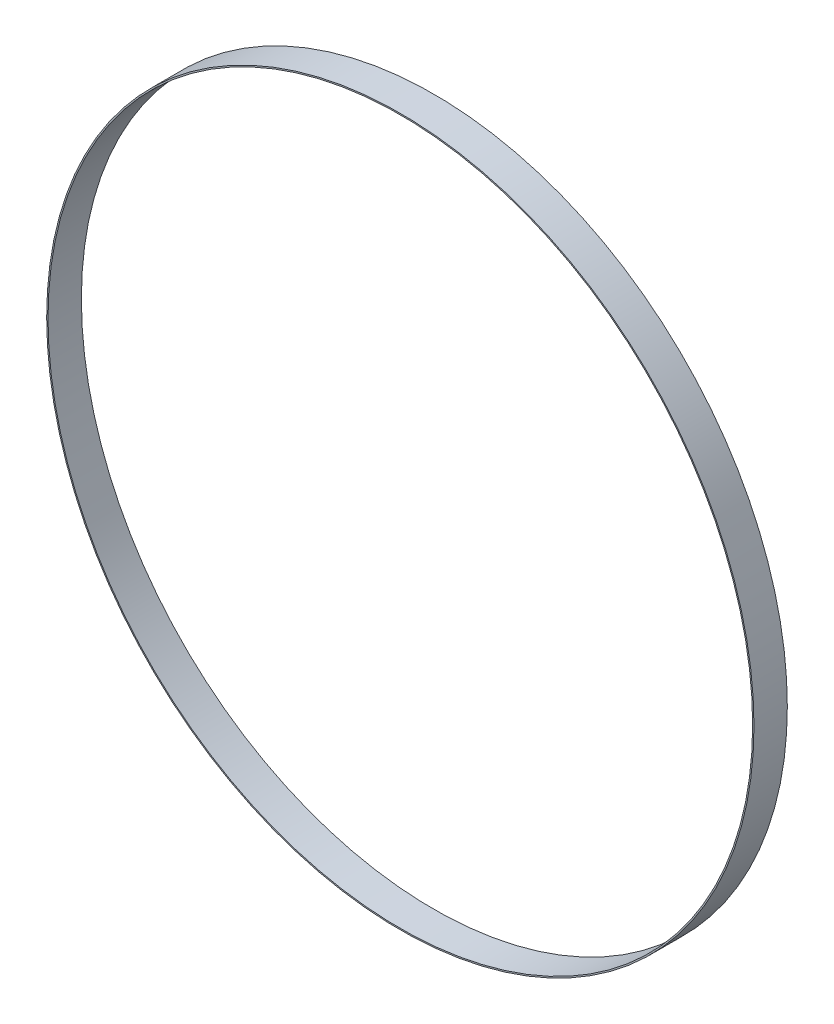
ISO-10303-21;
HEADER;
FILE_DESCRIPTION(('STEP AP214'),'2;1');
FILE_NAME('part.step','',(''),(''),'','','');
FILE_SCHEMA(('AUTOMOTIVE_DESIGN { 1 0 10303 214 1 1 1 1 }'));
ENDSEC;
DATA;
#1=APPLICATION_CONTEXT('core data for automotive mechanical design processes');
#2=APPLICATION_PROTOCOL_DEFINITION('international standard','automotive_design',2000,#1);
#3=PRODUCT_CONTEXT('',#1,'mechanical');
#4=PRODUCT('Part','Part','',(#3));
#5=PRODUCT_RELATED_PRODUCT_CATEGORY('part','',(#4));
#6=PRODUCT_DEFINITION_FORMATION('','',#4);
#7=PRODUCT_DEFINITION_CONTEXT('part definition',#1,'design');
#8=PRODUCT_DEFINITION('design','',#6,#7);
#9=PRODUCT_DEFINITION_SHAPE('','',#8);
#10=(LENGTH_UNIT() NAMED_UNIT(*) SI_UNIT(.MILLI.,.METRE.));
#11=(NAMED_UNIT(*) PLANE_ANGLE_UNIT() SI_UNIT($,.RADIAN.));
#12=(NAMED_UNIT(*) SI_UNIT($,.STERADIAN.) SOLID_ANGLE_UNIT());
#13=UNCERTAINTY_MEASURE_WITH_UNIT(LENGTH_MEASURE(1.E-05),#10,'distance_accuracy_value','');
#14=(GEOMETRIC_REPRESENTATION_CONTEXT(3) GLOBAL_UNCERTAINTY_ASSIGNED_CONTEXT((#13)) GLOBAL_UNIT_ASSIGNED_CONTEXT((#10,
#11,#12)) REPRESENTATION_CONTEXT('',''));
#15=CARTESIAN_POINT('',(0.,0.,0.));
#16=DIRECTION('',(0.,0.,1.));
#17=DIRECTION('',(1.,0.,0.));
#18=AXIS2_PLACEMENT_3D('',#15,#16,#17);
#19=CARTESIAN_POINT('',(0.,0.,100.));
#20=DIRECTION('',(0.,0.,1.));
#21=DIRECTION('',(1.,0.,0.));
#22=AXIS2_PLACEMENT_3D('',#19,#20,#21);
#23=PLANE('',#22);
#24=CARTESIAN_POINT('',(0.,0.,100.));
#25=DIRECTION('',(0.,0.,1.));
#26=DIRECTION('',(1.,0.,0.));
#27=AXIS2_PLACEMENT_3D('',#24,#25,#26);
#28=CIRCLE('',#27,1060.);
#29=CARTESIAN_POINT('',(1060.,0.,100.));
#30=VERTEX_POINT('',#29);
#31=EDGE_CURVE('E10',#30,#30,#28,.T.);
#32=ORIENTED_EDGE('',*,*,#31,.T.);
#33=EDGE_LOOP('',(#32));
#34=FACE_BOUND('',#33,.T.);
#35=CARTESIAN_POINT('',(0.,0.,100.));
#36=DIRECTION('',(0.,0.,1.));
#37=DIRECTION('',(1.,0.,0.));
#38=AXIS2_PLACEMENT_3D('',#35,#36,#37);
#39=CIRCLE('',#38,1056.);
#40=CARTESIAN_POINT('',(1056.,0.,100.));
#41=VERTEX_POINT('',#40);
#42=EDGE_CURVE('E43',#41,#41,#39,.T.);
#43=ORIENTED_EDGE('',*,*,#42,.F.);
#44=EDGE_LOOP('',(#43));
#45=FACE_BOUND('',#44,.T.);
#46=ADVANCED_FACE('F32',(#34,#45),#23,.T.);
#47=CARTESIAN_POINT('',(0.,0.,0.));
#48=DIRECTION('',(0.,0.,1.));
#49=DIRECTION('',(1.,0.,0.));
#50=AXIS2_PLACEMENT_3D('',#47,#48,#49);
#51=PLANE('',#50);
#52=CARTESIAN_POINT('',(0.,0.,0.));
#53=DIRECTION('',(0.,0.,1.));
#54=DIRECTION('',(1.,0.,0.));
#55=AXIS2_PLACEMENT_3D('',#52,#53,#54);
#56=CIRCLE('',#55,1060.);
#57=CARTESIAN_POINT('',(1060.,0.,0.));
#58=VERTEX_POINT('',#57);
#59=EDGE_CURVE('E36',#58,#58,#56,.T.);
#60=ORIENTED_EDGE('',*,*,#59,.F.);
#61=EDGE_LOOP('',(#60));
#62=FACE_BOUND('',#61,.T.);
#63=CARTESIAN_POINT('',(0.,0.,0.));
#64=DIRECTION('',(0.,0.,1.));
#65=DIRECTION('',(1.,0.,0.));
#66=AXIS2_PLACEMENT_3D('',#63,#64,#65);
#67=CIRCLE('',#66,1056.);
#68=CARTESIAN_POINT('',(1056.,0.,0.));
#69=VERTEX_POINT('',#68);
#70=EDGE_CURVE('E45',#69,#69,#67,.T.);
#71=ORIENTED_EDGE('',*,*,#70,.T.);
#72=EDGE_LOOP('',(#71));
#73=FACE_BOUND('',#72,.T.);
#74=ADVANCED_FACE('F55',(#62,#73),#51,.F.);
#75=CARTESIAN_POINT('',(0.,0.,100.));
#76=DIRECTION('',(0.,0.,-1.));
#77=DIRECTION('',(-1.,0.,0.));
#78=AXIS2_PLACEMENT_3D('',#75,#76,#77);
#79=CYLINDRICAL_SURFACE('',#78,1060.);
#80=ORIENTED_EDGE('',*,*,#31,.F.);
#81=EDGE_LOOP('',(#80));
#82=FACE_BOUND('',#81,.T.);
#83=ORIENTED_EDGE('',*,*,#59,.T.);
#84=EDGE_LOOP('',(#83));
#85=FACE_BOUND('',#84,.T.);
#86=ADVANCED_FACE('F34',(#82,#85),#79,.T.);
#87=CARTESIAN_POINT('',(0.,0.,100.));
#88=DIRECTION('',(0.,0.,-1.));
#89=DIRECTION('',(-1.,0.,0.));
#90=AXIS2_PLACEMENT_3D('',#87,#88,#89);
#91=CYLINDRICAL_SURFACE('',#90,1056.);
#92=ORIENTED_EDGE('',*,*,#42,.T.);
#93=EDGE_LOOP('',(#92));
#94=FACE_BOUND('',#93,.T.);
#95=ORIENTED_EDGE('',*,*,#70,.F.);
#96=EDGE_LOOP('',(#95));
#97=FACE_BOUND('',#96,.T.);
#98=ADVANCED_FACE('F51',(#94,#97),#91,.F.);
#99=CLOSED_SHELL('',(#46,#74,#86,#98));
#100=MANIFOLD_SOLID_BREP('B2',#99);
#101=ADVANCED_BREP_SHAPE_REPRESENTATION('',(#18,#100),#14);
#102=SHAPE_DEFINITION_REPRESENTATION(#9,#101);
ENDSEC;
END-ISO-10303-21;
